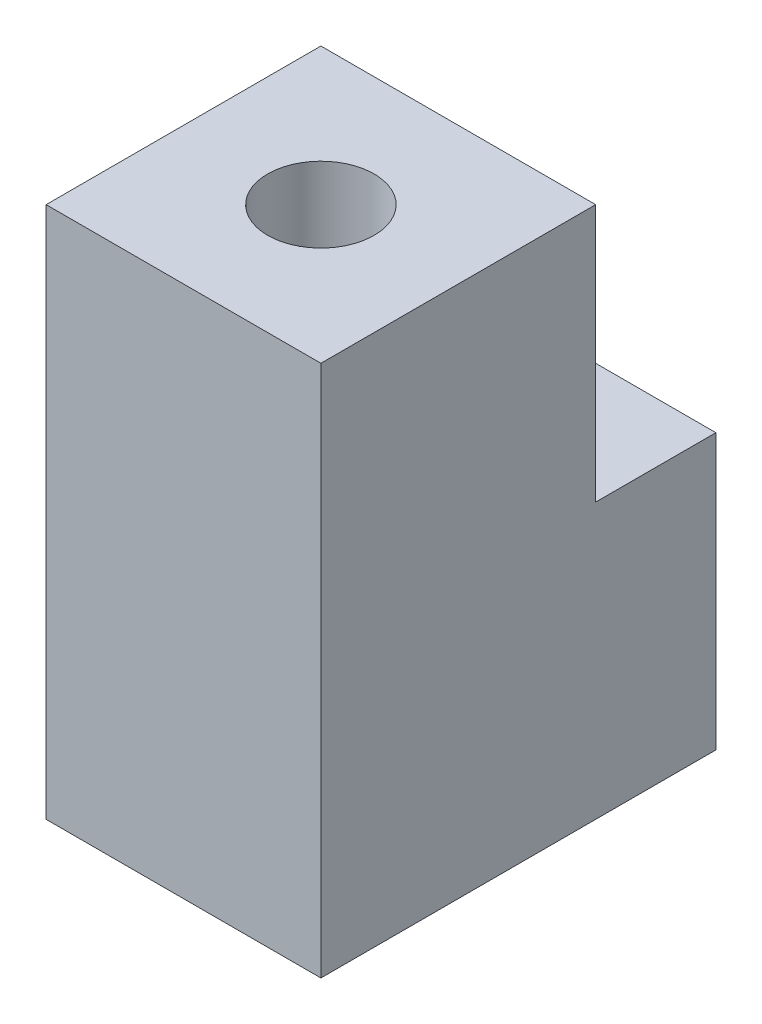
ISO-10303-21;
HEADER;
FILE_DESCRIPTION(('STEP AP214'),'2;1');
FILE_NAME('part.step','',(''),(''),'','','');
FILE_SCHEMA(('AUTOMOTIVE_DESIGN { 1 0 10303 214 1 1 1 1 }'));
ENDSEC;
DATA;
#1=APPLICATION_CONTEXT('core data for automotive mechanical design processes');
#2=APPLICATION_PROTOCOL_DEFINITION('international standard','automotive_design',2000,#1);
#3=PRODUCT_CONTEXT('',#1,'mechanical');
#4=PRODUCT('Part','Part','',(#3));
#5=PRODUCT_RELATED_PRODUCT_CATEGORY('part','',(#4));
#6=PRODUCT_DEFINITION_FORMATION('','',#4);
#7=PRODUCT_DEFINITION_CONTEXT('part definition',#1,'design');
#8=PRODUCT_DEFINITION('design','',#6,#7);
#9=PRODUCT_DEFINITION_SHAPE('','',#8);
#10=(LENGTH_UNIT() NAMED_UNIT(*) SI_UNIT(.MILLI.,.METRE.));
#11=(NAMED_UNIT(*) PLANE_ANGLE_UNIT() SI_UNIT($,.RADIAN.));
#12=(NAMED_UNIT(*) SI_UNIT($,.STERADIAN.) SOLID_ANGLE_UNIT());
#13=UNCERTAINTY_MEASURE_WITH_UNIT(LENGTH_MEASURE(1.E-05),#10,'distance_accuracy_value','');
#14=(GEOMETRIC_REPRESENTATION_CONTEXT(3) GLOBAL_UNCERTAINTY_ASSIGNED_CONTEXT((#13)) GLOBAL_UNIT_ASSIGNED_CONTEXT((#10,
#11,#12)) REPRESENTATION_CONTEXT('',''));
#15=CARTESIAN_POINT('',(0.,0.,0.));
#16=DIRECTION('',(0.,0.,1.));
#17=DIRECTION('',(1.,0.,0.));
#18=AXIS2_PLACEMENT_3D('',#15,#16,#17);
#19=CARTESIAN_POINT('',(0.,0.,20.));
#20=DIRECTION('',(0.,0.,1.));
#21=DIRECTION('',(1.,0.,0.));
#22=AXIS2_PLACEMENT_3D('',#19,#20,#21);
#23=PLANE('',#22);
#24=DIRECTION('',(1.,0.,0.));
#25=VECTOR('',#24,1.);
#26=CARTESIAN_POINT('',(-5.15,-5.15,20.));
#27=LINE('',#26,#25);
#28=CARTESIAN_POINT('',(5.15,-5.15,20.));
#29=VERTEX_POINT('',#28);
#30=CARTESIAN_POINT('',(-5.15,-5.15,20.));
#31=VERTEX_POINT('',#30);
#32=EDGE_CURVE('E115',#29,#31,#27,.F.);
#33=ORIENTED_EDGE('',*,*,#32,.T.);
#34=DIRECTION('',(0.,1.,0.));
#35=VECTOR('',#34,1.);
#36=CARTESIAN_POINT('',(-5.15,5.15,20.));
#37=LINE('',#36,#35);
#38=CARTESIAN_POINT('',(-5.15,5.15,20.));
#39=VERTEX_POINT('',#38);
#40=EDGE_CURVE('E98',#31,#39,#37,.T.);
#41=ORIENTED_EDGE('',*,*,#40,.T.);
#42=DIRECTION('',(1.,0.,0.));
#43=VECTOR('',#42,1.);
#44=CARTESIAN_POINT('',(5.15,5.15,20.));
#45=LINE('',#44,#43);
#46=CARTESIAN_POINT('',(5.15,5.15,20.));
#47=VERTEX_POINT('',#46);
#48=EDGE_CURVE('E95',#39,#47,#45,.T.);
#49=ORIENTED_EDGE('',*,*,#48,.T.);
#50=DIRECTION('',(0.,1.,0.));
#51=VECTOR('',#50,1.);
#52=CARTESIAN_POINT('',(5.15,-5.15,20.));
#53=LINE('',#52,#51);
#54=EDGE_CURVE('E92',#47,#29,#53,.F.);
#55=ORIENTED_EDGE('',*,*,#54,.T.);
#56=EDGE_LOOP('',(#33,#41,#49,#55));
#57=FACE_BOUND('',#56,.T.);
#58=ADVANCED_FACE('F17',(#57),#23,.F.);
#59=CARTESIAN_POINT('',(8.,8.,0.));
#60=DIRECTION('',(0.,1.,0.));
#61=DIRECTION('',(0.,0.,1.));
#62=AXIS2_PLACEMENT_3D('',#59,#60,#61);
#63=PLANE('',#62);
#64=CARTESIAN_POINT('',(0.,8.,15.));
#65=DIRECTION('',(0.,1.,0.));
#66=DIRECTION('',(0.,0.,1.));
#67=AXIS2_PLACEMENT_3D('',#64,#65,#66);
#68=CIRCLE('',#67,3.1);
#69=CARTESIAN_POINT('',(0.,8.,18.1));
#70=VERTEX_POINT('',#69);
#71=EDGE_CURVE('E20',#70,#70,#68,.T.);
#72=ORIENTED_EDGE('',*,*,#71,.T.);
#73=EDGE_LOOP('',(#72));
#74=FACE_BOUND('',#73,.T.);
#75=ADVANCED_FACE('F323',(#74),#63,.T.);
#76=CARTESIAN_POINT('',(5.15,5.15,0.));
#77=DIRECTION('',(0.,1.,0.));
#78=DIRECTION('',(0.,0.,1.));
#79=AXIS2_PLACEMENT_3D('',#76,#77,#78);
#80=PLANE('',#79);
#81=ORIENTED_EDGE('',*,*,#48,.F.);
#82=DIRECTION('',(0.,0.,1.));
#83=VECTOR('',#82,1.);
#84=CARTESIAN_POINT('',(-5.15,5.15,0.));
#85=LINE('',#84,#83);
#86=CARTESIAN_POINT('',(-5.15,5.15,0.));
#87=VERTEX_POINT('',#86);
#88=EDGE_CURVE('E156',#39,#87,#85,.F.);
#89=ORIENTED_EDGE('',*,*,#88,.T.);
#90=DIRECTION('',(1.,0.,0.));
#91=VECTOR('',#90,1.);
#92=CARTESIAN_POINT('',(0.,5.15,0.));
#93=LINE('',#92,#91);
#94=CARTESIAN_POINT('',(5.15,5.15,0.));
#95=VERTEX_POINT('',#94);
#96=EDGE_CURVE('E106',#87,#95,#93,.T.);
#97=ORIENTED_EDGE('',*,*,#96,.T.);
#98=DIRECTION('',(0.,0.,1.));
#99=VECTOR('',#98,1.);
#100=CARTESIAN_POINT('',(5.15,5.15,0.));
#101=LINE('',#100,#99);
#102=EDGE_CURVE('E101',#95,#47,#101,.T.);
#103=ORIENTED_EDGE('',*,*,#102,.T.);
#104=EDGE_LOOP('',(#81,#89,#97,#103));
#105=FACE_BOUND('',#104,.T.);
#106=ADVANCED_FACE('F104',(#105),#80,.F.);
#107=CARTESIAN_POINT('',(5.15,-5.15,0.));
#108=DIRECTION('',(1.,0.,0.));
#109=DIRECTION('',(0.,1.,0.));
#110=AXIS2_PLACEMENT_3D('',#107,#108,#109);
#111=PLANE('',#110);
#112=ORIENTED_EDGE('',*,*,#54,.F.);
#113=ORIENTED_EDGE('',*,*,#102,.F.);
#114=DIRECTION('',(0.,1.,0.));
#115=VECTOR('',#114,1.);
#116=CARTESIAN_POINT('',(5.15,0.,0.));
#117=LINE('',#116,#115);
#118=CARTESIAN_POINT('',(5.15,-5.15,0.));
#119=VERTEX_POINT('',#118);
#120=EDGE_CURVE('E151',#95,#119,#117,.F.);
#121=ORIENTED_EDGE('',*,*,#120,.T.);
#122=DIRECTION('',(0.,0.,-1.));
#123=VECTOR('',#122,1.);
#124=CARTESIAN_POINT('',(5.15,-5.15,0.));
#125=LINE('',#124,#123);
#126=EDGE_CURVE('E112',#119,#29,#125,.F.);
#127=ORIENTED_EDGE('',*,*,#126,.T.);
#128=EDGE_LOOP('',(#112,#113,#121,#127));
#129=FACE_BOUND('',#128,.T.);
#130=ADVANCED_FACE('F110',(#129),#111,.F.);
#131=CARTESIAN_POINT('',(-5.15,-5.15,0.));
#132=DIRECTION('',(0.,-1.,0.));
#133=DIRECTION('',(0.,0.,-1.));
#134=AXIS2_PLACEMENT_3D('',#131,#132,#133);
#135=PLANE('',#134);
#136=ORIENTED_EDGE('',*,*,#32,.F.);
#137=ORIENTED_EDGE('',*,*,#126,.F.);
#138=DIRECTION('',(1.,0.,0.));
#139=VECTOR('',#138,1.);
#140=CARTESIAN_POINT('',(0.,-5.15,0.));
#141=LINE('',#140,#139);
#142=CARTESIAN_POINT('',(-5.15,-5.15,0.));
#143=VERTEX_POINT('',#142);
#144=EDGE_CURVE('E149',#119,#143,#141,.F.);
#145=ORIENTED_EDGE('',*,*,#144,.T.);
#146=DIRECTION('',(0.,0.,1.));
#147=VECTOR('',#146,1.);
#148=CARTESIAN_POINT('',(-5.15,-5.15,0.));
#149=LINE('',#148,#147);
#150=EDGE_CURVE('E159',#143,#31,#149,.T.);
#151=ORIENTED_EDGE('',*,*,#150,.T.);
#152=EDGE_LOOP('',(#136,#137,#145,#151));
#153=FACE_BOUND('',#152,.T.);
#154=ADVANCED_FACE('F163',(#153),#135,.F.);
#155=CARTESIAN_POINT('',(-5.15,5.15,0.));
#156=DIRECTION('',(-1.,0.,0.));
#157=DIRECTION('',(0.,0.,1.));
#158=AXIS2_PLACEMENT_3D('',#155,#156,#157);
#159=PLANE('',#158);
#160=ORIENTED_EDGE('',*,*,#40,.F.);
#161=ORIENTED_EDGE('',*,*,#150,.F.);
#162=DIRECTION('',(0.,1.,0.));
#163=VECTOR('',#162,1.);
#164=CARTESIAN_POINT('',(-5.15,0.,0.));
#165=LINE('',#164,#163);
#166=EDGE_CURVE('E146',#143,#87,#165,.T.);
#167=ORIENTED_EDGE('',*,*,#166,.T.);
#168=ORIENTED_EDGE('',*,*,#88,.F.);
#169=EDGE_LOOP('',(#160,#161,#167,#168));
#170=FACE_BOUND('',#169,.T.);
#171=ADVANCED_FACE('F167',(#170),#159,.F.);
#172=CARTESIAN_POINT('',(0.,8.,15.));
#173=DIRECTION('',(0.,1.,0.));
#174=DIRECTION('',(0.,0.,1.));
#175=AXIS2_PLACEMENT_3D('',#172,#173,#174);
#176=CYLINDRICAL_SURFACE('',#175,3.1);
#177=CARTESIAN_POINT('',(0.,23.,15.));
#178=DIRECTION('',(0.,1.,0.));
#179=DIRECTION('',(0.,0.,1.));
#180=AXIS2_PLACEMENT_3D('',#177,#178,#179);
#181=CIRCLE('',#180,3.1);
#182=CARTESIAN_POINT('',(0.,23.,18.1));
#183=VERTEX_POINT('',#182);
#184=EDGE_CURVE('E118',#183,#183,#181,.F.);
#185=ORIENTED_EDGE('',*,*,#184,.F.);
#186=EDGE_LOOP('',(#185));
#187=FACE_BOUND('',#186,.T.);
#188=ORIENTED_EDGE('',*,*,#71,.F.);
#189=EDGE_LOOP('',(#188));
#190=FACE_BOUND('',#189,.T.);
#191=ADVANCED_FACE('F276',(#187,#190),#176,.F.);
#192=CARTESIAN_POINT('',(8.,-8.,0.));
#193=DIRECTION('',(1.,0.,0.));
#194=DIRECTION('',(0.,0.,-1.));
#195=AXIS2_PLACEMENT_3D('',#192,#193,#194);
#196=PLANE('',#195);
#197=DIRECTION('',(0.,0.,1.));
#198=VECTOR('',#197,1.);
#199=CARTESIAN_POINT('',(8.,23.,0.));
#200=LINE('',#199,#198);
#201=CARTESIAN_POINT('',(8.,23.,23.));
#202=VERTEX_POINT('',#201);
#203=CARTESIAN_POINT('',(8.,23.,7.));
#204=VERTEX_POINT('',#203);
#205=EDGE_CURVE('E121',#202,#204,#200,.F.);
#206=ORIENTED_EDGE('',*,*,#205,.F.);
#207=DIRECTION('',(0.,1.,0.));
#208=VECTOR('',#207,1.);
#209=CARTESIAN_POINT('',(8.,0.,23.));
#210=LINE('',#209,#208);
#211=CARTESIAN_POINT('',(8.,-8.,23.));
#212=VERTEX_POINT('',#211);
#213=EDGE_CURVE('E133',#212,#202,#210,.T.);
#214=ORIENTED_EDGE('',*,*,#213,.F.);
#215=DIRECTION('',(0.,0.,-1.));
#216=VECTOR('',#215,1.);
#217=CARTESIAN_POINT('',(8.,-8.,0.));
#218=LINE('',#217,#216);
#219=CARTESIAN_POINT('',(8.,-8.,0.));
#220=VERTEX_POINT('',#219);
#221=EDGE_CURVE('E144',#220,#212,#218,.F.);
#222=ORIENTED_EDGE('',*,*,#221,.F.);
#223=DIRECTION('',(0.,1.,0.));
#224=VECTOR('',#223,1.);
#225=CARTESIAN_POINT('',(8.,0.,0.));
#226=LINE('',#225,#224);
#227=CARTESIAN_POINT('',(8.,8.,0.));
#228=VERTEX_POINT('',#227);
#229=EDGE_CURVE('E154',#220,#228,#226,.T.);
#230=ORIENTED_EDGE('',*,*,#229,.T.);
#231=DIRECTION('',(0.,0.,1.));
#232=VECTOR('',#231,1.);
#233=CARTESIAN_POINT('',(8.,8.,0.));
#234=LINE('',#233,#232);
#235=CARTESIAN_POINT('',(8.,8.,7.));
#236=VERTEX_POINT('',#235);
#237=EDGE_CURVE('E200',#236,#228,#234,.F.);
#238=ORIENTED_EDGE('',*,*,#237,.F.);
#239=DIRECTION('',(0.,1.,0.));
#240=VECTOR('',#239,1.);
#241=CARTESIAN_POINT('',(8.,8.,7.));
#242=LINE('',#241,#240);
#243=EDGE_CURVE('E125',#204,#236,#242,.F.);
#244=ORIENTED_EDGE('',*,*,#243,.F.);
#245=EDGE_LOOP('',(#206,#214,#222,#230,#238,#244));
#246=FACE_BOUND('',#245,.T.);
#247=ADVANCED_FACE('F173',(#246),#196,.T.);
#248=CARTESIAN_POINT('',(0.,0.,0.));
#249=DIRECTION('',(0.,0.,1.));
#250=DIRECTION('',(1.,0.,0.));
#251=AXIS2_PLACEMENT_3D('',#248,#249,#250);
#252=PLANE('',#251);
#253=ORIENTED_EDGE('',*,*,#144,.F.);
#254=ORIENTED_EDGE('',*,*,#120,.F.);
#255=ORIENTED_EDGE('',*,*,#96,.F.);
#256=ORIENTED_EDGE('',*,*,#166,.F.);
#257=EDGE_LOOP('',(#253,#254,#255,#256));
#258=FACE_BOUND('',#257,.T.);
#259=ORIENTED_EDGE('',*,*,#229,.F.);
#260=DIRECTION('',(1.,0.,0.));
#261=VECTOR('',#260,1.);
#262=CARTESIAN_POINT('',(-8.,-8.,0.));
#263=LINE('',#262,#261);
#264=CARTESIAN_POINT('',(-8.,-8.,0.));
#265=VERTEX_POINT('',#264);
#266=EDGE_CURVE('E141',#265,#220,#263,.T.);
#267=ORIENTED_EDGE('',*,*,#266,.F.);
#268=DIRECTION('',(0.,1.,0.));
#269=VECTOR('',#268,1.);
#270=CARTESIAN_POINT('',(-8.,8.,0.));
#271=LINE('',#270,#269);
#272=CARTESIAN_POINT('',(-8.,8.,0.));
#273=VERTEX_POINT('',#272);
#274=EDGE_CURVE('E191',#273,#265,#271,.F.);
#275=ORIENTED_EDGE('',*,*,#274,.F.);
#276=DIRECTION('',(1.,0.,0.));
#277=VECTOR('',#276,1.);
#278=CARTESIAN_POINT('',(8.,8.,0.));
#279=LINE('',#278,#277);
#280=EDGE_CURVE('E179',#228,#273,#279,.F.);
#281=ORIENTED_EDGE('',*,*,#280,.F.);
#282=EDGE_LOOP('',(#259,#267,#275,#281));
#283=FACE_BOUND('',#282,.T.);
#284=ADVANCED_FACE('F169',(#258,#283),#252,.F.);
#285=CARTESIAN_POINT('',(-8.,-8.,0.));
#286=DIRECTION('',(0.,-1.,0.));
#287=DIRECTION('',(0.,0.,-1.));
#288=AXIS2_PLACEMENT_3D('',#285,#286,#287);
#289=PLANE('',#288);
#290=DIRECTION('',(0.,0.,1.));
#291=VECTOR('',#290,1.);
#292=CARTESIAN_POINT('',(-8.,-8.,0.));
#293=LINE('',#292,#291);
#294=CARTESIAN_POINT('',(-8.,-8.,23.));
#295=VERTEX_POINT('',#294);
#296=EDGE_CURVE('E185',#265,#295,#293,.T.);
#297=ORIENTED_EDGE('',*,*,#296,.F.);
#298=ORIENTED_EDGE('',*,*,#266,.T.);
#299=ORIENTED_EDGE('',*,*,#221,.T.);
#300=DIRECTION('',(1.,0.,0.));
#301=VECTOR('',#300,1.);
#302=CARTESIAN_POINT('',(0.,-8.,23.));
#303=LINE('',#302,#301);
#304=EDGE_CURVE('E138',#295,#212,#303,.T.);
#305=ORIENTED_EDGE('',*,*,#304,.F.);
#306=EDGE_LOOP('',(#297,#298,#299,#305));
#307=FACE_BOUND('',#306,.T.);
#308=ADVANCED_FACE('F172',(#307),#289,.T.);
#309=CARTESIAN_POINT('',(0.,0.,23.));
#310=DIRECTION('',(0.,0.,1.));
#311=DIRECTION('',(1.,0.,0.));
#312=AXIS2_PLACEMENT_3D('',#309,#310,#311);
#313=PLANE('',#312);
#314=DIRECTION('',(1.,0.,0.));
#315=VECTOR('',#314,1.);
#316=CARTESIAN_POINT('',(0.,23.,23.));
#317=LINE('',#316,#315);
#318=CARTESIAN_POINT('',(-8.,23.,23.));
#319=VERTEX_POINT('',#318);
#320=EDGE_CURVE('E127',#319,#202,#317,.T.);
#321=ORIENTED_EDGE('',*,*,#320,.F.);
#322=DIRECTION('',(0.,1.,0.));
#323=VECTOR('',#322,1.);
#324=CARTESIAN_POINT('',(-8.,8.,23.));
#325=LINE('',#324,#323);
#326=EDGE_CURVE('E190',#295,#319,#325,.T.);
#327=ORIENTED_EDGE('',*,*,#326,.F.);
#328=ORIENTED_EDGE('',*,*,#304,.T.);
#329=ORIENTED_EDGE('',*,*,#213,.T.);
#330=EDGE_LOOP('',(#321,#327,#328,#329));
#331=FACE_BOUND('',#330,.T.);
#332=ADVANCED_FACE('F210',(#331),#313,.T.);
#333=CARTESIAN_POINT('',(0.,23.,0.));
#334=DIRECTION('',(0.,1.,0.));
#335=DIRECTION('',(0.,0.,1.));
#336=AXIS2_PLACEMENT_3D('',#333,#334,#335);
#337=PLANE('',#336);
#338=ORIENTED_EDGE('',*,*,#184,.T.);
#339=EDGE_LOOP('',(#338));
#340=FACE_BOUND('',#339,.T.);
#341=ORIENTED_EDGE('',*,*,#320,.T.);
#342=ORIENTED_EDGE('',*,*,#205,.T.);
#343=DIRECTION('',(-1.,0.,0.));
#344=VECTOR('',#343,1.);
#345=CARTESIAN_POINT('',(8.,23.,7.));
#346=LINE('',#345,#344);
#347=CARTESIAN_POINT('',(-8.,23.,7.));
#348=VERTEX_POINT('',#347);
#349=EDGE_CURVE('E120',#348,#204,#346,.F.);
#350=ORIENTED_EDGE('',*,*,#349,.F.);
#351=DIRECTION('',(0.,0.,1.));
#352=VECTOR('',#351,1.);
#353=CARTESIAN_POINT('',(-8.,23.,0.));
#354=LINE('',#353,#352);
#355=EDGE_CURVE('E206',#319,#348,#354,.F.);
#356=ORIENTED_EDGE('',*,*,#355,.F.);
#357=EDGE_LOOP('',(#341,#342,#350,#356));
#358=FACE_BOUND('',#357,.T.);
#359=ADVANCED_FACE('F211',(#340,#358),#337,.T.);
#360=CARTESIAN_POINT('',(8.,8.,7.));
#361=DIRECTION('',(0.,0.,-1.));
#362=DIRECTION('',(-1.,0.,0.));
#363=AXIS2_PLACEMENT_3D('',#360,#361,#362);
#364=PLANE('',#363);
#365=ORIENTED_EDGE('',*,*,#243,.T.);
#366=DIRECTION('',(1.,0.,0.));
#367=VECTOR('',#366,1.);
#368=CARTESIAN_POINT('',(8.,8.,7.));
#369=LINE('',#368,#367);
#370=CARTESIAN_POINT('',(-8.,8.,7.));
#371=VERTEX_POINT('',#370);
#372=EDGE_CURVE('E35',#371,#236,#369,.T.);
#373=ORIENTED_EDGE('',*,*,#372,.F.);
#374=DIRECTION('',(0.,1.,0.));
#375=VECTOR('',#374,1.);
#376=CARTESIAN_POINT('',(-8.,8.,7.));
#377=LINE('',#376,#375);
#378=EDGE_CURVE('E26',#348,#371,#377,.F.);
#379=ORIENTED_EDGE('',*,*,#378,.F.);
#380=ORIENTED_EDGE('',*,*,#349,.T.);
#381=EDGE_LOOP('',(#365,#373,#379,#380));
#382=FACE_BOUND('',#381,.T.);
#383=ADVANCED_FACE('F201',(#382),#364,.T.);
#384=CARTESIAN_POINT('',(8.,8.,0.));
#385=DIRECTION('',(0.,1.,0.));
#386=DIRECTION('',(0.,0.,1.));
#387=AXIS2_PLACEMENT_3D('',#384,#385,#386);
#388=PLANE('',#387);
#389=DIRECTION('',(0.,0.,1.));
#390=VECTOR('',#389,1.);
#391=CARTESIAN_POINT('',(-8.,8.,0.));
#392=LINE('',#391,#390);
#393=EDGE_CURVE('E11',#371,#273,#392,.F.);
#394=ORIENTED_EDGE('',*,*,#393,.F.);
#395=ORIENTED_EDGE('',*,*,#372,.T.);
#396=ORIENTED_EDGE('',*,*,#237,.T.);
#397=ORIENTED_EDGE('',*,*,#280,.T.);
#398=EDGE_LOOP('',(#394,#395,#396,#397));
#399=FACE_BOUND('',#398,.T.);
#400=ADVANCED_FACE('F203',(#399),#388,.T.);
#401=CARTESIAN_POINT('',(-8.,8.,0.));
#402=DIRECTION('',(-1.,0.,0.));
#403=DIRECTION('',(0.,0.,1.));
#404=AXIS2_PLACEMENT_3D('',#401,#402,#403);
#405=PLANE('',#404);
#406=ORIENTED_EDGE('',*,*,#378,.T.);
#407=ORIENTED_EDGE('',*,*,#393,.T.);
#408=ORIENTED_EDGE('',*,*,#274,.T.);
#409=ORIENTED_EDGE('',*,*,#296,.T.);
#410=ORIENTED_EDGE('',*,*,#326,.T.);
#411=ORIENTED_EDGE('',*,*,#355,.T.);
#412=EDGE_LOOP('',(#406,#407,#408,#409,#410,#411));
#413=FACE_BOUND('',#412,.T.);
#414=ADVANCED_FACE('F194',(#413),#405,.T.);
#415=CLOSED_SHELL('',(#58,#75,#106,#130,#154,#171,#191,#247,#284,#308,#332,#359,#383,#400,#414));
#416=MANIFOLD_SOLID_BREP('B1',#415);
#417=ADVANCED_BREP_SHAPE_REPRESENTATION('',(#18,#416),#14);
#418=SHAPE_DEFINITION_REPRESENTATION(#9,#417);
ENDSEC;
END-ISO-10303-21;
